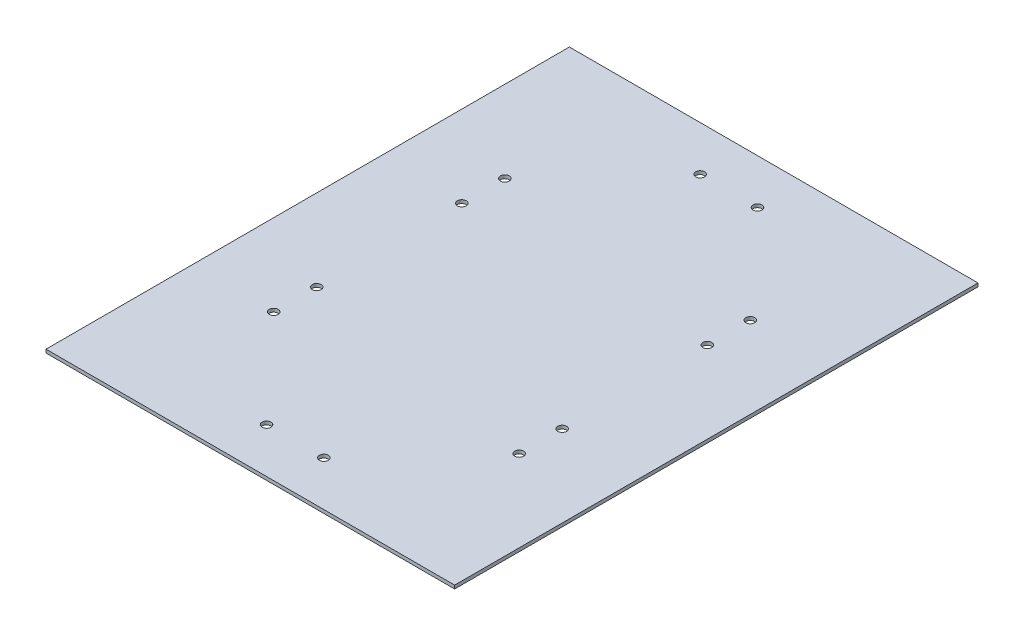
ISO-10303-21;
HEADER;
FILE_DESCRIPTION(('STEP AP214'),'2;1');
FILE_NAME('part.step','',(''),(''),'','','');
FILE_SCHEMA(('AUTOMOTIVE_DESIGN { 1 0 10303 214 1 1 1 1 }'));
ENDSEC;
DATA;
#1=APPLICATION_CONTEXT('core data for automotive mechanical design processes');
#2=APPLICATION_PROTOCOL_DEFINITION('international standard','automotive_design',2000,#1);
#3=PRODUCT_CONTEXT('',#1,'mechanical');
#4=PRODUCT('Part','Part','',(#3));
#5=PRODUCT_RELATED_PRODUCT_CATEGORY('part','',(#4));
#6=PRODUCT_DEFINITION_FORMATION('','',#4);
#7=PRODUCT_DEFINITION_CONTEXT('part definition',#1,'design');
#8=PRODUCT_DEFINITION('design','',#6,#7);
#9=PRODUCT_DEFINITION_SHAPE('','',#8);
#10=(LENGTH_UNIT() NAMED_UNIT(*) SI_UNIT(.MILLI.,.METRE.));
#11=(NAMED_UNIT(*) PLANE_ANGLE_UNIT() SI_UNIT($,.RADIAN.));
#12=(NAMED_UNIT(*) SI_UNIT($,.STERADIAN.) SOLID_ANGLE_UNIT());
#13=UNCERTAINTY_MEASURE_WITH_UNIT(LENGTH_MEASURE(1.E-05),#10,'distance_accuracy_value','');
#14=(GEOMETRIC_REPRESENTATION_CONTEXT(3) GLOBAL_UNCERTAINTY_ASSIGNED_CONTEXT((#13)) GLOBAL_UNIT_ASSIGNED_CONTEXT((#10,
#11,#12)) REPRESENTATION_CONTEXT('',''));
#15=CARTESIAN_POINT('',(0.,0.,0.));
#16=DIRECTION('',(0.,0.,1.));
#17=DIRECTION('',(1.,0.,0.));
#18=AXIS2_PLACEMENT_3D('',#15,#16,#17);
#19=CARTESIAN_POINT('',(0.,3.,0.));
#20=DIRECTION('',(0.,-1.,0.));
#21=DIRECTION('',(0.,0.,-1.));
#22=AXIS2_PLACEMENT_3D('',#19,#20,#21);
#23=PLANE('',#22);
#24=CARTESIAN_POINT('',(108.712,3.,-102.362));
#25=DIRECTION('',(0.,1.,0.));
#26=DIRECTION('',(0.,0.,-1.));
#27=AXIS2_PLACEMENT_3D('',#24,#25,#26);
#28=CIRCLE('',#27,3.93699999999994);
#29=CARTESIAN_POINT('',(108.712,3.,-106.299));
#30=VERTEX_POINT('',#29);
#31=EDGE_CURVE('E168',#30,#30,#28,.T.);
#32=ORIENTED_EDGE('',*,*,#31,.F.);
#33=EDGE_LOOP('',(#32));
#34=FACE_BOUND('',#33,.T.);
#35=CARTESIAN_POINT('',(108.712,3.,102.362));
#36=DIRECTION('',(0.,1.,0.));
#37=DIRECTION('',(0.,0.,1.));
#38=AXIS2_PLACEMENT_3D('',#35,#36,#37);
#39=CIRCLE('',#38,3.93699999999994);
#40=CARTESIAN_POINT('',(108.712,3.,106.299));
#41=VERTEX_POINT('',#40);
#42=EDGE_CURVE('E156',#41,#41,#39,.T.);
#43=ORIENTED_EDGE('',*,*,#42,.F.);
#44=EDGE_LOOP('',(#43));
#45=FACE_BOUND('',#44,.T.);
#46=CARTESIAN_POINT('',(25.4,3.,192.024));
#47=DIRECTION('',(0.,1.,0.));
#48=DIRECTION('',(0.,0.,1.));
#49=AXIS2_PLACEMENT_3D('',#46,#47,#48);
#50=CIRCLE('',#49,3.937);
#51=CARTESIAN_POINT('',(25.4,3.,195.961));
#52=VERTEX_POINT('',#51);
#53=EDGE_CURVE('E144',#52,#52,#50,.T.);
#54=ORIENTED_EDGE('',*,*,#53,.F.);
#55=EDGE_LOOP('',(#54));
#56=FACE_BOUND('',#55,.T.);
#57=CARTESIAN_POINT('',(-25.4,3.,-192.024));
#58=DIRECTION('',(0.,1.,0.));
#59=DIRECTION('',(0.,0.,1.));
#60=AXIS2_PLACEMENT_3D('',#57,#58,#59);
#61=CIRCLE('',#60,3.937);
#62=CARTESIAN_POINT('',(-25.4,3.,-188.087));
#63=VERTEX_POINT('',#62);
#64=EDGE_CURVE('E132',#63,#63,#61,.T.);
#65=ORIENTED_EDGE('',*,*,#64,.F.);
#66=EDGE_LOOP('',(#65));
#67=FACE_BOUND('',#66,.T.);
#68=CARTESIAN_POINT('',(-108.712,3.,102.362));
#69=DIRECTION('',(0.,1.,0.));
#70=DIRECTION('',(0.,0.,-1.));
#71=AXIS2_PLACEMENT_3D('',#68,#69,#70);
#72=CIRCLE('',#71,3.93700000000005);
#73=CARTESIAN_POINT('',(-108.712,3.,98.425));
#74=VERTEX_POINT('',#73);
#75=EDGE_CURVE('E120',#74,#74,#72,.T.);
#76=ORIENTED_EDGE('',*,*,#75,.F.);
#77=EDGE_LOOP('',(#76));
#78=FACE_BOUND('',#77,.T.);
#79=CARTESIAN_POINT('',(-108.712,3.,-64.262));
#80=DIRECTION('',(0.,1.,0.));
#81=DIRECTION('',(0.,0.,1.));
#82=AXIS2_PLACEMENT_3D('',#79,#80,#81);
#83=CIRCLE('',#82,3.93700000000006);
#84=CARTESIAN_POINT('',(-108.712,3.,-60.3249999999999));
#85=VERTEX_POINT('',#84);
#86=EDGE_CURVE('E99',#85,#85,#83,.T.);
#87=ORIENTED_EDGE('',*,*,#86,.F.);
#88=EDGE_LOOP('',(#87));
#89=FACE_BOUND('',#88,.T.);
#90=DIRECTION('',(0.,0.,-1.));
#91=VECTOR('',#90,1.);
#92=CARTESIAN_POINT('',(180.975,3.,231.775));
#93=LINE('',#92,#91);
#94=CARTESIAN_POINT('',(180.975,3.,231.775));
#95=VERTEX_POINT('',#94);
#96=CARTESIAN_POINT('',(180.975,3.,-231.775));
#97=VERTEX_POINT('',#96);
#98=EDGE_CURVE('E84',#95,#97,#93,.T.);
#99=ORIENTED_EDGE('',*,*,#98,.T.);
#100=DIRECTION('',(-1.,0.,0.));
#101=VECTOR('',#100,1.);
#102=CARTESIAN_POINT('',(-180.975,3.,-231.775));
#103=LINE('',#102,#101);
#104=CARTESIAN_POINT('',(-180.975,3.,-231.775));
#105=VERTEX_POINT('',#104);
#106=EDGE_CURVE('E79',#97,#105,#103,.T.);
#107=ORIENTED_EDGE('',*,*,#106,.T.);
#108=DIRECTION('',(0.,0.,1.));
#109=VECTOR('',#108,1.);
#110=CARTESIAN_POINT('',(-180.975,3.,231.775));
#111=LINE('',#110,#109);
#112=CARTESIAN_POINT('',(-180.975,3.,231.775));
#113=VERTEX_POINT('',#112);
#114=EDGE_CURVE('E82',#105,#113,#111,.T.);
#115=ORIENTED_EDGE('',*,*,#114,.T.);
#116=DIRECTION('',(1.,0.,0.));
#117=VECTOR('',#116,1.);
#118=CARTESIAN_POINT('',(-180.975,3.,231.775));
#119=LINE('',#118,#117);
#120=EDGE_CURVE('E49',#113,#95,#119,.T.);
#121=ORIENTED_EDGE('',*,*,#120,.T.);
#122=EDGE_LOOP('',(#99,#107,#115,#121));
#123=FACE_BOUND('',#122,.T.);
#124=CARTESIAN_POINT('',(-108.712,3.,-102.362));
#125=DIRECTION('',(0.,1.,0.));
#126=DIRECTION('',(0.,0.,1.));
#127=AXIS2_PLACEMENT_3D('',#124,#125,#126);
#128=CIRCLE('',#127,3.93700000000005);
#129=CARTESIAN_POINT('',(-108.712,3.,-98.425));
#130=VERTEX_POINT('',#129);
#131=EDGE_CURVE('E114',#130,#130,#128,.T.);
#132=ORIENTED_EDGE('',*,*,#131,.F.);
#133=EDGE_LOOP('',(#132));
#134=FACE_BOUND('',#133,.T.);
#135=CARTESIAN_POINT('',(-108.712,3.,64.262));
#136=DIRECTION('',(0.,1.,0.));
#137=DIRECTION('',(0.,0.,-1.));
#138=AXIS2_PLACEMENT_3D('',#135,#136,#137);
#139=CIRCLE('',#138,3.93700000000006);
#140=CARTESIAN_POINT('',(-108.712,3.,60.3249999999999));
#141=VERTEX_POINT('',#140);
#142=EDGE_CURVE('E126',#141,#141,#139,.T.);
#143=ORIENTED_EDGE('',*,*,#142,.F.);
#144=EDGE_LOOP('',(#143));
#145=FACE_BOUND('',#144,.T.);
#146=CARTESIAN_POINT('',(-25.4,3.,192.024));
#147=DIRECTION('',(0.,1.,0.));
#148=DIRECTION('',(0.,0.,-1.));
#149=AXIS2_PLACEMENT_3D('',#146,#147,#148);
#150=CIRCLE('',#149,3.937);
#151=CARTESIAN_POINT('',(-25.4,3.,188.087));
#152=VERTEX_POINT('',#151);
#153=EDGE_CURVE('E138',#152,#152,#150,.T.);
#154=ORIENTED_EDGE('',*,*,#153,.F.);
#155=EDGE_LOOP('',(#154));
#156=FACE_BOUND('',#155,.T.);
#157=CARTESIAN_POINT('',(108.712,3.,64.262));
#158=DIRECTION('',(0.,1.,0.));
#159=DIRECTION('',(0.,0.,1.));
#160=AXIS2_PLACEMENT_3D('',#157,#158,#159);
#161=CIRCLE('',#160,3.93699999999996);
#162=CARTESIAN_POINT('',(108.712,3.,68.1989999999999));
#163=VERTEX_POINT('',#162);
#164=EDGE_CURVE('E150',#163,#163,#161,.T.);
#165=ORIENTED_EDGE('',*,*,#164,.F.);
#166=EDGE_LOOP('',(#165));
#167=FACE_BOUND('',#166,.T.);
#168=CARTESIAN_POINT('',(25.4,3.,-192.024));
#169=DIRECTION('',(0.,1.,0.));
#170=DIRECTION('',(0.,0.,-1.));
#171=AXIS2_PLACEMENT_3D('',#168,#169,#170);
#172=CIRCLE('',#171,3.937);
#173=CARTESIAN_POINT('',(25.4,3.,-195.961));
#174=VERTEX_POINT('',#173);
#175=EDGE_CURVE('E162',#174,#174,#172,.T.);
#176=ORIENTED_EDGE('',*,*,#175,.F.);
#177=EDGE_LOOP('',(#176));
#178=FACE_BOUND('',#177,.T.);
#179=CARTESIAN_POINT('',(108.712,3.,-64.262));
#180=DIRECTION('',(0.,1.,0.));
#181=DIRECTION('',(0.,0.,-1.));
#182=AXIS2_PLACEMENT_3D('',#179,#180,#181);
#183=CIRCLE('',#182,3.93699999999996);
#184=CARTESIAN_POINT('',(108.712,3.,-68.1989999999999));
#185=VERTEX_POINT('',#184);
#186=EDGE_CURVE('E174',#185,#185,#183,.T.);
#187=ORIENTED_EDGE('',*,*,#186,.F.);
#188=EDGE_LOOP('',(#187));
#189=FACE_BOUND('',#188,.T.);
#190=ADVANCED_FACE('F32',(#34,#45,#56,#67,#78,#89,#123,#134,#145,#156,#167,#178,#189),#23,.F.);
#191=CARTESIAN_POINT('',(0.,0.,0.));
#192=DIRECTION('',(0.,-1.,0.));
#193=DIRECTION('',(0.,0.,-1.));
#194=AXIS2_PLACEMENT_3D('',#191,#192,#193);
#195=PLANE('',#194);
#196=CARTESIAN_POINT('',(108.712,0.,-102.362));
#197=DIRECTION('',(0.,1.,0.));
#198=DIRECTION('',(0.,0.,-1.));
#199=AXIS2_PLACEMENT_3D('',#196,#197,#198);
#200=CIRCLE('',#199,3.93699999999994);
#201=CARTESIAN_POINT('',(108.712,0.,-106.299));
#202=VERTEX_POINT('',#201);
#203=EDGE_CURVE('E171',#202,#202,#200,.T.);
#204=ORIENTED_EDGE('',*,*,#203,.T.);
#205=EDGE_LOOP('',(#204));
#206=FACE_BOUND('',#205,.T.);
#207=CARTESIAN_POINT('',(108.712,0.,102.362));
#208=DIRECTION('',(0.,1.,0.));
#209=DIRECTION('',(0.,0.,1.));
#210=AXIS2_PLACEMENT_3D('',#207,#208,#209);
#211=CIRCLE('',#210,3.93699999999994);
#212=CARTESIAN_POINT('',(108.712,0.,106.299));
#213=VERTEX_POINT('',#212);
#214=EDGE_CURVE('E159',#213,#213,#211,.T.);
#215=ORIENTED_EDGE('',*,*,#214,.T.);
#216=EDGE_LOOP('',(#215));
#217=FACE_BOUND('',#216,.T.);
#218=CARTESIAN_POINT('',(25.4,0.,192.024));
#219=DIRECTION('',(0.,1.,0.));
#220=DIRECTION('',(0.,0.,1.));
#221=AXIS2_PLACEMENT_3D('',#218,#219,#220);
#222=CIRCLE('',#221,3.937);
#223=CARTESIAN_POINT('',(25.4,0.,195.961));
#224=VERTEX_POINT('',#223);
#225=EDGE_CURVE('E147',#224,#224,#222,.T.);
#226=ORIENTED_EDGE('',*,*,#225,.T.);
#227=EDGE_LOOP('',(#226));
#228=FACE_BOUND('',#227,.T.);
#229=CARTESIAN_POINT('',(-25.4,0.,-192.024));
#230=DIRECTION('',(0.,1.,0.));
#231=DIRECTION('',(0.,0.,1.));
#232=AXIS2_PLACEMENT_3D('',#229,#230,#231);
#233=CIRCLE('',#232,3.937);
#234=CARTESIAN_POINT('',(-25.4,0.,-188.087));
#235=VERTEX_POINT('',#234);
#236=EDGE_CURVE('E135',#235,#235,#233,.T.);
#237=ORIENTED_EDGE('',*,*,#236,.T.);
#238=EDGE_LOOP('',(#237));
#239=FACE_BOUND('',#238,.T.);
#240=CARTESIAN_POINT('',(-108.712,0.,102.362));
#241=DIRECTION('',(0.,1.,0.));
#242=DIRECTION('',(0.,0.,-1.));
#243=AXIS2_PLACEMENT_3D('',#240,#241,#242);
#244=CIRCLE('',#243,3.93700000000005);
#245=CARTESIAN_POINT('',(-108.712,0.,98.425));
#246=VERTEX_POINT('',#245);
#247=EDGE_CURVE('E123',#246,#246,#244,.T.);
#248=ORIENTED_EDGE('',*,*,#247,.T.);
#249=EDGE_LOOP('',(#248));
#250=FACE_BOUND('',#249,.T.);
#251=CARTESIAN_POINT('',(-108.712,0.,-64.262));
#252=DIRECTION('',(0.,1.,0.));
#253=DIRECTION('',(0.,0.,1.));
#254=AXIS2_PLACEMENT_3D('',#251,#252,#253);
#255=CIRCLE('',#254,3.93700000000006);
#256=CARTESIAN_POINT('',(-108.712,0.,-60.3249999999999));
#257=VERTEX_POINT('',#256);
#258=EDGE_CURVE('E111',#257,#257,#255,.T.);
#259=ORIENTED_EDGE('',*,*,#258,.T.);
#260=EDGE_LOOP('',(#259));
#261=FACE_BOUND('',#260,.T.);
#262=DIRECTION('',(0.,0.,-1.));
#263=VECTOR('',#262,1.);
#264=CARTESIAN_POINT('',(180.975,0.,231.775));
#265=LINE('',#264,#263);
#266=CARTESIAN_POINT('',(180.975,0.,231.775));
#267=VERTEX_POINT('',#266);
#268=CARTESIAN_POINT('',(180.975,0.,-231.775));
#269=VERTEX_POINT('',#268);
#270=EDGE_CURVE('E96',#267,#269,#265,.T.);
#271=ORIENTED_EDGE('',*,*,#270,.F.);
#272=DIRECTION('',(1.,0.,0.));
#273=VECTOR('',#272,1.);
#274=CARTESIAN_POINT('',(-180.975,0.,231.775));
#275=LINE('',#274,#273);
#276=CARTESIAN_POINT('',(-180.975,0.,231.775));
#277=VERTEX_POINT('',#276);
#278=EDGE_CURVE('E72',#277,#267,#275,.T.);
#279=ORIENTED_EDGE('',*,*,#278,.F.);
#280=DIRECTION('',(0.,0.,1.));
#281=VECTOR('',#280,1.);
#282=CARTESIAN_POINT('',(-180.975,0.,231.775));
#283=LINE('',#282,#281);
#284=CARTESIAN_POINT('',(-180.975,0.,-231.775));
#285=VERTEX_POINT('',#284);
#286=EDGE_CURVE('E66',#285,#277,#283,.T.);
#287=ORIENTED_EDGE('',*,*,#286,.F.);
#288=DIRECTION('',(-1.,0.,0.));
#289=VECTOR('',#288,1.);
#290=CARTESIAN_POINT('',(-180.975,0.,-231.775));
#291=LINE('',#290,#289);
#292=EDGE_CURVE('E88',#269,#285,#291,.T.);
#293=ORIENTED_EDGE('',*,*,#292,.F.);
#294=EDGE_LOOP('',(#271,#279,#287,#293));
#295=FACE_BOUND('',#294,.T.);
#296=CARTESIAN_POINT('',(-108.712,0.,-102.362));
#297=DIRECTION('',(0.,1.,0.));
#298=DIRECTION('',(0.,0.,1.));
#299=AXIS2_PLACEMENT_3D('',#296,#297,#298);
#300=CIRCLE('',#299,3.93700000000005);
#301=CARTESIAN_POINT('',(-108.712,0.,-98.425));
#302=VERTEX_POINT('',#301);
#303=EDGE_CURVE('E117',#302,#302,#300,.T.);
#304=ORIENTED_EDGE('',*,*,#303,.T.);
#305=EDGE_LOOP('',(#304));
#306=FACE_BOUND('',#305,.T.);
#307=CARTESIAN_POINT('',(-108.712,0.,64.262));
#308=DIRECTION('',(0.,1.,0.));
#309=DIRECTION('',(0.,0.,-1.));
#310=AXIS2_PLACEMENT_3D('',#307,#308,#309);
#311=CIRCLE('',#310,3.93700000000006);
#312=CARTESIAN_POINT('',(-108.712,0.,60.3249999999999));
#313=VERTEX_POINT('',#312);
#314=EDGE_CURVE('E129',#313,#313,#311,.T.);
#315=ORIENTED_EDGE('',*,*,#314,.T.);
#316=EDGE_LOOP('',(#315));
#317=FACE_BOUND('',#316,.T.);
#318=CARTESIAN_POINT('',(-25.4,0.,192.024));
#319=DIRECTION('',(0.,1.,0.));
#320=DIRECTION('',(0.,0.,-1.));
#321=AXIS2_PLACEMENT_3D('',#318,#319,#320);
#322=CIRCLE('',#321,3.937);
#323=CARTESIAN_POINT('',(-25.4,0.,188.087));
#324=VERTEX_POINT('',#323);
#325=EDGE_CURVE('E141',#324,#324,#322,.T.);
#326=ORIENTED_EDGE('',*,*,#325,.T.);
#327=EDGE_LOOP('',(#326));
#328=FACE_BOUND('',#327,.T.);
#329=CARTESIAN_POINT('',(108.712,0.,64.262));
#330=DIRECTION('',(0.,1.,0.));
#331=DIRECTION('',(0.,0.,1.));
#332=AXIS2_PLACEMENT_3D('',#329,#330,#331);
#333=CIRCLE('',#332,3.93699999999996);
#334=CARTESIAN_POINT('',(108.712,0.,68.1989999999999));
#335=VERTEX_POINT('',#334);
#336=EDGE_CURVE('E153',#335,#335,#333,.T.);
#337=ORIENTED_EDGE('',*,*,#336,.T.);
#338=EDGE_LOOP('',(#337));
#339=FACE_BOUND('',#338,.T.);
#340=CARTESIAN_POINT('',(25.4,0.,-192.024));
#341=DIRECTION('',(0.,1.,0.));
#342=DIRECTION('',(0.,0.,-1.));
#343=AXIS2_PLACEMENT_3D('',#340,#341,#342);
#344=CIRCLE('',#343,3.937);
#345=CARTESIAN_POINT('',(25.4,0.,-195.961));
#346=VERTEX_POINT('',#345);
#347=EDGE_CURVE('E165',#346,#346,#344,.T.);
#348=ORIENTED_EDGE('',*,*,#347,.T.);
#349=EDGE_LOOP('',(#348));
#350=FACE_BOUND('',#349,.T.);
#351=CARTESIAN_POINT('',(108.712,0.,-64.262));
#352=DIRECTION('',(0.,1.,0.));
#353=DIRECTION('',(0.,0.,-1.));
#354=AXIS2_PLACEMENT_3D('',#351,#352,#353);
#355=CIRCLE('',#354,3.93699999999996);
#356=CARTESIAN_POINT('',(108.712,0.,-68.1989999999999));
#357=VERTEX_POINT('',#356);
#358=EDGE_CURVE('E177',#357,#357,#355,.T.);
#359=ORIENTED_EDGE('',*,*,#358,.T.);
#360=EDGE_LOOP('',(#359));
#361=FACE_BOUND('',#360,.T.);
#362=ADVANCED_FACE('F107',(#206,#217,#228,#239,#250,#261,#295,#306,#317,#328,#339,#350,#361),
#195,.T.);
#363=CARTESIAN_POINT('',(180.975,3.,231.775));
#364=DIRECTION('',(-1.,0.,0.));
#365=DIRECTION('',(0.,0.,1.));
#366=AXIS2_PLACEMENT_3D('',#363,#364,#365);
#367=PLANE('',#366);
#368=ORIENTED_EDGE('',*,*,#270,.T.);
#369=DIRECTION('',(0.,-1.,0.));
#370=VECTOR('',#369,1.);
#371=CARTESIAN_POINT('',(180.975,3.,-231.775));
#372=LINE('',#371,#370);
#373=EDGE_CURVE('E11',#97,#269,#372,.T.);
#374=ORIENTED_EDGE('',*,*,#373,.F.);
#375=ORIENTED_EDGE('',*,*,#98,.F.);
#376=DIRECTION('',(0.,-1.,0.));
#377=VECTOR('',#376,1.);
#378=CARTESIAN_POINT('',(180.975,3.,231.775));
#379=LINE('',#378,#377);
#380=EDGE_CURVE('E92',#95,#267,#379,.T.);
#381=ORIENTED_EDGE('',*,*,#380,.T.);
#382=EDGE_LOOP('',(#368,#374,#375,#381));
#383=FACE_BOUND('',#382,.T.);
#384=ADVANCED_FACE('F34',(#383),#367,.F.);
#385=CARTESIAN_POINT('',(-180.975,3.,-231.775));
#386=DIRECTION('',(0.,0.,1.));
#387=DIRECTION('',(1.,0.,0.));
#388=AXIS2_PLACEMENT_3D('',#385,#386,#387);
#389=PLANE('',#388);
#390=ORIENTED_EDGE('',*,*,#292,.T.);
#391=DIRECTION('',(0.,-1.,0.));
#392=VECTOR('',#391,1.);
#393=CARTESIAN_POINT('',(-180.975,3.,-231.775));
#394=LINE('',#393,#392);
#395=EDGE_CURVE('E41',#105,#285,#394,.T.);
#396=ORIENTED_EDGE('',*,*,#395,.F.);
#397=ORIENTED_EDGE('',*,*,#106,.F.);
#398=ORIENTED_EDGE('',*,*,#373,.T.);
#399=EDGE_LOOP('',(#390,#396,#397,#398));
#400=FACE_BOUND('',#399,.T.);
#401=ADVANCED_FACE('F87',(#400),#389,.F.);
#402=CARTESIAN_POINT('',(-180.975,3.,231.775));
#403=DIRECTION('',(1.,0.,0.));
#404=DIRECTION('',(0.,0.,-1.));
#405=AXIS2_PLACEMENT_3D('',#402,#403,#404);
#406=PLANE('',#405);
#407=ORIENTED_EDGE('',*,*,#286,.T.);
#408=DIRECTION('',(0.,-1.,0.));
#409=VECTOR('',#408,1.);
#410=CARTESIAN_POINT('',(-180.975,3.,231.775));
#411=LINE('',#410,#409);
#412=EDGE_CURVE('E89',#113,#277,#411,.T.);
#413=ORIENTED_EDGE('',*,*,#412,.F.);
#414=ORIENTED_EDGE('',*,*,#114,.F.);
#415=ORIENTED_EDGE('',*,*,#395,.T.);
#416=EDGE_LOOP('',(#407,#413,#414,#415));
#417=FACE_BOUND('',#416,.T.);
#418=ADVANCED_FACE('F90',(#417),#406,.F.);
#419=CARTESIAN_POINT('',(-180.975,3.,231.775));
#420=DIRECTION('',(0.,0.,-1.));
#421=DIRECTION('',(-1.,0.,0.));
#422=AXIS2_PLACEMENT_3D('',#419,#420,#421);
#423=PLANE('',#422);
#424=ORIENTED_EDGE('',*,*,#278,.T.);
#425=ORIENTED_EDGE('',*,*,#380,.F.);
#426=ORIENTED_EDGE('',*,*,#120,.F.);
#427=ORIENTED_EDGE('',*,*,#412,.T.);
#428=EDGE_LOOP('',(#424,#425,#426,#427));
#429=FACE_BOUND('',#428,.T.);
#430=ADVANCED_FACE('F104',(#429),#423,.F.);
#431=CARTESIAN_POINT('',(-108.712,3.,-64.262));
#432=DIRECTION('',(0.,-1.,0.));
#433=DIRECTION('',(0.,0.,-1.));
#434=AXIS2_PLACEMENT_3D('',#431,#432,#433);
#435=CYLINDRICAL_SURFACE('',#434,3.93700000000006);
#436=ORIENTED_EDGE('',*,*,#86,.T.);
#437=EDGE_LOOP('',(#436));
#438=FACE_BOUND('',#437,.T.);
#439=ORIENTED_EDGE('',*,*,#258,.F.);
#440=EDGE_LOOP('',(#439));
#441=FACE_BOUND('',#440,.T.);
#442=ADVANCED_FACE('F197',(#438,#441),#435,.F.);
#443=CARTESIAN_POINT('',(-108.712,3.,-102.362));
#444=DIRECTION('',(0.,-1.,0.));
#445=DIRECTION('',(0.,0.,-1.));
#446=AXIS2_PLACEMENT_3D('',#443,#444,#445);
#447=CYLINDRICAL_SURFACE('',#446,3.93700000000005);
#448=ORIENTED_EDGE('',*,*,#131,.T.);
#449=EDGE_LOOP('',(#448));
#450=FACE_BOUND('',#449,.T.);
#451=ORIENTED_EDGE('',*,*,#303,.F.);
#452=EDGE_LOOP('',(#451));
#453=FACE_BOUND('',#452,.T.);
#454=ADVANCED_FACE('F243',(#450,#453),#447,.F.);
#455=CARTESIAN_POINT('',(-108.712,3.,102.362));
#456=DIRECTION('',(0.,-1.,0.));
#457=DIRECTION('',(0.,0.,-1.));
#458=AXIS2_PLACEMENT_3D('',#455,#456,#457);
#459=CYLINDRICAL_SURFACE('',#458,3.93700000000005);
#460=ORIENTED_EDGE('',*,*,#75,.T.);
#461=EDGE_LOOP('',(#460));
#462=FACE_BOUND('',#461,.T.);
#463=ORIENTED_EDGE('',*,*,#247,.F.);
#464=EDGE_LOOP('',(#463));
#465=FACE_BOUND('',#464,.T.);
#466=ADVANCED_FACE('F251',(#462,#465),#459,.F.);
#467=CARTESIAN_POINT('',(-108.712,3.,64.262));
#468=DIRECTION('',(0.,-1.,0.));
#469=DIRECTION('',(0.,0.,-1.));
#470=AXIS2_PLACEMENT_3D('',#467,#468,#469);
#471=CYLINDRICAL_SURFACE('',#470,3.93700000000006);
#472=ORIENTED_EDGE('',*,*,#142,.T.);
#473=EDGE_LOOP('',(#472));
#474=FACE_BOUND('',#473,.T.);
#475=ORIENTED_EDGE('',*,*,#314,.F.);
#476=EDGE_LOOP('',(#475));
#477=FACE_BOUND('',#476,.T.);
#478=ADVANCED_FACE('F259',(#474,#477),#471,.F.);
#479=CARTESIAN_POINT('',(-25.4,3.,-192.024));
#480=DIRECTION('',(0.,-1.,0.));
#481=DIRECTION('',(0.,0.,-1.));
#482=AXIS2_PLACEMENT_3D('',#479,#480,#481);
#483=CYLINDRICAL_SURFACE('',#482,3.937);
#484=ORIENTED_EDGE('',*,*,#64,.T.);
#485=EDGE_LOOP('',(#484));
#486=FACE_BOUND('',#485,.T.);
#487=ORIENTED_EDGE('',*,*,#236,.F.);
#488=EDGE_LOOP('',(#487));
#489=FACE_BOUND('',#488,.T.);
#490=ADVANCED_FACE('F268',(#486,#489),#483,.F.);
#491=CARTESIAN_POINT('',(-25.4,3.,192.024));
#492=DIRECTION('',(0.,-1.,0.));
#493=DIRECTION('',(0.,0.,-1.));
#494=AXIS2_PLACEMENT_3D('',#491,#492,#493);
#495=CYLINDRICAL_SURFACE('',#494,3.937);
#496=ORIENTED_EDGE('',*,*,#153,.T.);
#497=EDGE_LOOP('',(#496));
#498=FACE_BOUND('',#497,.T.);
#499=ORIENTED_EDGE('',*,*,#325,.F.);
#500=EDGE_LOOP('',(#499));
#501=FACE_BOUND('',#500,.T.);
#502=ADVANCED_FACE('F277',(#498,#501),#495,.F.);
#503=CARTESIAN_POINT('',(25.4,3.,192.024));
#504=DIRECTION('',(0.,-1.,0.));
#505=DIRECTION('',(0.,0.,-1.));
#506=AXIS2_PLACEMENT_3D('',#503,#504,#505);
#507=CYLINDRICAL_SURFACE('',#506,3.937);
#508=ORIENTED_EDGE('',*,*,#53,.T.);
#509=EDGE_LOOP('',(#508));
#510=FACE_BOUND('',#509,.T.);
#511=ORIENTED_EDGE('',*,*,#225,.F.);
#512=EDGE_LOOP('',(#511));
#513=FACE_BOUND('',#512,.T.);
#514=ADVANCED_FACE('F286',(#510,#513),#507,.F.);
#515=CARTESIAN_POINT('',(108.712,3.,64.262));
#516=DIRECTION('',(0.,-1.,0.));
#517=DIRECTION('',(0.,0.,-1.));
#518=AXIS2_PLACEMENT_3D('',#515,#516,#517);
#519=CYLINDRICAL_SURFACE('',#518,3.93699999999996);
#520=ORIENTED_EDGE('',*,*,#164,.T.);
#521=EDGE_LOOP('',(#520));
#522=FACE_BOUND('',#521,.T.);
#523=ORIENTED_EDGE('',*,*,#336,.F.);
#524=EDGE_LOOP('',(#523));
#525=FACE_BOUND('',#524,.T.);
#526=ADVANCED_FACE('F295',(#522,#525),#519,.F.);
#527=CARTESIAN_POINT('',(108.712,3.,102.362));
#528=DIRECTION('',(0.,-1.,0.));
#529=DIRECTION('',(0.,0.,-1.));
#530=AXIS2_PLACEMENT_3D('',#527,#528,#529);
#531=CYLINDRICAL_SURFACE('',#530,3.93699999999994);
#532=ORIENTED_EDGE('',*,*,#42,.T.);
#533=EDGE_LOOP('',(#532));
#534=FACE_BOUND('',#533,.T.);
#535=ORIENTED_EDGE('',*,*,#214,.F.);
#536=EDGE_LOOP('',(#535));
#537=FACE_BOUND('',#536,.T.);
#538=ADVANCED_FACE('F304',(#534,#537),#531,.F.);
#539=CARTESIAN_POINT('',(25.4,3.,-192.024));
#540=DIRECTION('',(0.,-1.,0.));
#541=DIRECTION('',(0.,0.,-1.));
#542=AXIS2_PLACEMENT_3D('',#539,#540,#541);
#543=CYLINDRICAL_SURFACE('',#542,3.937);
#544=ORIENTED_EDGE('',*,*,#175,.T.);
#545=EDGE_LOOP('',(#544));
#546=FACE_BOUND('',#545,.T.);
#547=ORIENTED_EDGE('',*,*,#347,.F.);
#548=EDGE_LOOP('',(#547));
#549=FACE_BOUND('',#548,.T.);
#550=ADVANCED_FACE('F313',(#546,#549),#543,.F.);
#551=CARTESIAN_POINT('',(108.712,3.,-102.362));
#552=DIRECTION('',(0.,-1.,0.));
#553=DIRECTION('',(0.,0.,-1.));
#554=AXIS2_PLACEMENT_3D('',#551,#552,#553);
#555=CYLINDRICAL_SURFACE('',#554,3.93699999999994);
#556=ORIENTED_EDGE('',*,*,#31,.T.);
#557=EDGE_LOOP('',(#556));
#558=FACE_BOUND('',#557,.T.);
#559=ORIENTED_EDGE('',*,*,#203,.F.);
#560=EDGE_LOOP('',(#559));
#561=FACE_BOUND('',#560,.T.);
#562=ADVANCED_FACE('F322',(#558,#561),#555,.F.);
#563=CARTESIAN_POINT('',(108.712,3.,-64.262));
#564=DIRECTION('',(0.,-1.,0.));
#565=DIRECTION('',(0.,0.,-1.));
#566=AXIS2_PLACEMENT_3D('',#563,#564,#565);
#567=CYLINDRICAL_SURFACE('',#566,3.93699999999996);
#568=ORIENTED_EDGE('',*,*,#186,.T.);
#569=EDGE_LOOP('',(#568));
#570=FACE_BOUND('',#569,.T.);
#571=ORIENTED_EDGE('',*,*,#358,.F.);
#572=EDGE_LOOP('',(#571));
#573=FACE_BOUND('',#572,.T.);
#574=ADVANCED_FACE('F183',(#570,#573),#567,.F.);
#575=CLOSED_SHELL('',(#190,#362,#384,#401,#418,#430,#442,#454,#466,#478,#490,#502,#514,#526,
#538,#550,#562,#574));
#576=MANIFOLD_SOLID_BREP('B2',#575);
#577=ADVANCED_BREP_SHAPE_REPRESENTATION('',(#18,#576),#14);
#578=SHAPE_DEFINITION_REPRESENTATION(#9,#577);
ENDSEC;
END-ISO-10303-21;
